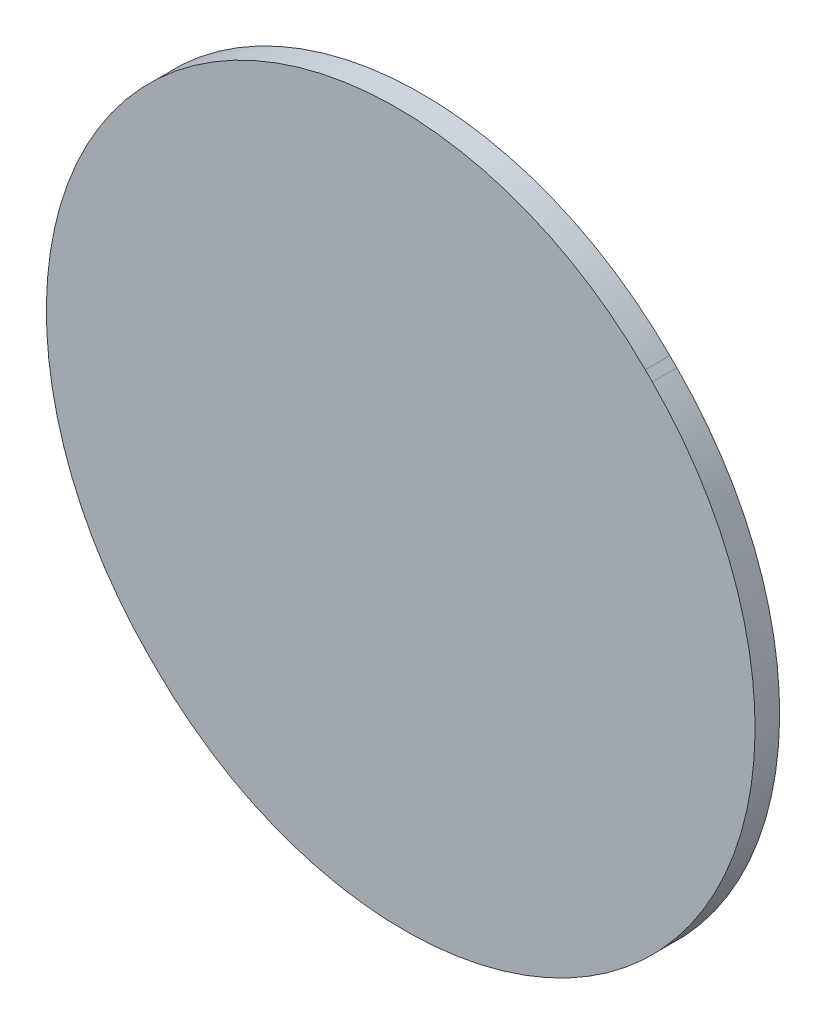
ISO-10303-21;
HEADER;
FILE_DESCRIPTION(('STEP AP214'),'2;1');
FILE_NAME('part.step','',(''),(''),'','','');
FILE_SCHEMA(('AUTOMOTIVE_DESIGN { 1 0 10303 214 1 1 1 1 }'));
ENDSEC;
DATA;
#1=APPLICATION_CONTEXT('core data for automotive mechanical design processes');
#2=APPLICATION_PROTOCOL_DEFINITION('international standard','automotive_design',2000,#1);
#3=PRODUCT_CONTEXT('',#1,'mechanical');
#4=PRODUCT('Part','Part','',(#3));
#5=PRODUCT_RELATED_PRODUCT_CATEGORY('part','',(#4));
#6=PRODUCT_DEFINITION_FORMATION('','',#4);
#7=PRODUCT_DEFINITION_CONTEXT('part definition',#1,'design');
#8=PRODUCT_DEFINITION('design','',#6,#7);
#9=PRODUCT_DEFINITION_SHAPE('','',#8);
#10=(LENGTH_UNIT() NAMED_UNIT(*) SI_UNIT(.MILLI.,.METRE.));
#11=(NAMED_UNIT(*) PLANE_ANGLE_UNIT() SI_UNIT($,.RADIAN.));
#12=(NAMED_UNIT(*) SI_UNIT($,.STERADIAN.) SOLID_ANGLE_UNIT());
#13=UNCERTAINTY_MEASURE_WITH_UNIT(LENGTH_MEASURE(1.E-05),#10,'distance_accuracy_value','');
#14=(GEOMETRIC_REPRESENTATION_CONTEXT(3) GLOBAL_UNCERTAINTY_ASSIGNED_CONTEXT((#13)) GLOBAL_UNIT_ASSIGNED_CONTEXT((#10,
#11,#12)) REPRESENTATION_CONTEXT('',''));
#15=CARTESIAN_POINT('',(0.,0.,0.));
#16=DIRECTION('',(0.,0.,1.));
#17=DIRECTION('',(1.,0.,0.));
#18=AXIS2_PLACEMENT_3D('',#15,#16,#17);
#19=CARTESIAN_POINT('',(123.696446,-93.823553,1.635));
#20=DIRECTION('',(0.,0.,1.));
#21=DIRECTION('',(1.,0.,0.));
#22=AXIS2_PLACEMENT_3D('',#19,#20,#21);
#23=PLANE('',#22);
#24=DIRECTION('',(0.707106781187048,-0.707106781186048,0.));
#25=VECTOR('',#24,1.);
#26=CARTESIAN_POINT('',(123.696446,-93.823553,1.635));
#27=LINE('',#26,#25);
#28=CARTESIAN_POINT('',(123.696446,-93.823553,1.635));
#29=VERTEX_POINT('',#28);
#30=CARTESIAN_POINT('',(123.706446,-93.833553,1.635));
#31=VERTEX_POINT('',#30);
#32=EDGE_CURVE('E84',#29,#31,#27,.T.);
#33=ORIENTED_EDGE('',*,*,#32,.T.);
#34=CARTESIAN_POINT('',(124.0599995,-93.4799995,1.635));
#35=DIRECTION('',(0.,0.,1.));
#36=DIRECTION('',(-0.707106781186548,-0.707106781186548,0.));
#37=AXIS2_PLACEMENT_3D('',#34,#35,#36);
#38=CIRCLE('',#37,0.500000154724);
#39=CARTESIAN_POINT('',(124.413553,-93.126446,1.635));
#40=VERTEX_POINT('',#39);
#41=EDGE_CURVE('E99',#31,#40,#38,.T.);
#42=ORIENTED_EDGE('',*,*,#41,.T.);
#43=DIRECTION('',(-0.707106781186048,0.707106781187048,0.));
#44=VECTOR('',#43,1.);
#45=CARTESIAN_POINT('',(124.413553,-93.126446,1.635));
#46=LINE('',#45,#44);
#47=CARTESIAN_POINT('',(124.403553,-93.116446,1.635));
#48=VERTEX_POINT('',#47);
#49=EDGE_CURVE('E76',#40,#48,#46,.T.);
#50=ORIENTED_EDGE('',*,*,#49,.T.);
#51=CARTESIAN_POINT('',(124.0499995,-93.4699995,1.635));
#52=DIRECTION('',(0.,0.,1.));
#53=DIRECTION('',(0.707106781186548,0.707106781186548,0.));
#54=AXIS2_PLACEMENT_3D('',#51,#52,#53);
#55=CIRCLE('',#54,0.500000154724);
#56=EDGE_CURVE('E11',#48,#29,#55,.T.);
#57=ORIENTED_EDGE('',*,*,#56,.T.);
#58=EDGE_LOOP('',(#33,#42,#50,#57));
#59=FACE_BOUND('',#58,.T.);
#60=ADVANCED_FACE('F17',(#59),#23,.T.);
#61=CARTESIAN_POINT('',(123.696446,-93.823553,1.6));
#62=DIRECTION('',(0.,0.,1.));
#63=DIRECTION('',(1.,0.,0.));
#64=AXIS2_PLACEMENT_3D('',#61,#62,#63);
#65=PLANE('',#64);
#66=CARTESIAN_POINT('',(124.0499995,-93.4699995,1.6));
#67=DIRECTION('',(0.,0.,1.));
#68=DIRECTION('',(0.707106781186548,0.707106781186548,0.));
#69=AXIS2_PLACEMENT_3D('',#66,#67,#68);
#70=CIRCLE('',#69,0.500000154724);
#71=CARTESIAN_POINT('',(124.403553,-93.116446,1.6));
#72=VERTEX_POINT('',#71);
#73=CARTESIAN_POINT('',(123.696446,-93.823553,1.6));
#74=VERTEX_POINT('',#73);
#75=EDGE_CURVE('E27',#72,#74,#70,.T.);
#76=ORIENTED_EDGE('',*,*,#75,.F.);
#77=DIRECTION('',(-0.707106781186048,0.707106781187048,0.));
#78=VECTOR('',#77,1.);
#79=CARTESIAN_POINT('',(124.413553,-93.126446,1.6));
#80=LINE('',#79,#78);
#81=CARTESIAN_POINT('',(124.413553,-93.126446,1.6));
#82=VERTEX_POINT('',#81);
#83=EDGE_CURVE('E110',#82,#72,#80,.T.);
#84=ORIENTED_EDGE('',*,*,#83,.F.);
#85=CARTESIAN_POINT('',(124.0599995,-93.4799995,1.6));
#86=DIRECTION('',(0.,0.,1.));
#87=DIRECTION('',(-0.707106781186548,-0.707106781186548,0.));
#88=AXIS2_PLACEMENT_3D('',#85,#86,#87);
#89=CIRCLE('',#88,0.500000154724);
#90=CARTESIAN_POINT('',(123.706446,-93.833553,1.6));
#91=VERTEX_POINT('',#90);
#92=EDGE_CURVE('E86',#91,#82,#89,.T.);
#93=ORIENTED_EDGE('',*,*,#92,.F.);
#94=DIRECTION('',(0.707106781187048,-0.707106781186048,0.));
#95=VECTOR('',#94,1.);
#96=CARTESIAN_POINT('',(123.696446,-93.823553,1.6));
#97=LINE('',#96,#95);
#98=EDGE_CURVE('E82',#74,#91,#97,.T.);
#99=ORIENTED_EDGE('',*,*,#98,.F.);
#100=EDGE_LOOP('',(#76,#84,#93,#99));
#101=FACE_BOUND('',#100,.T.);
#102=ADVANCED_FACE('F19',(#101),#65,.F.);
#103=CARTESIAN_POINT('',(124.0499995,-93.4699995,1.6));
#104=DIRECTION('',(0.,0.,-1.));
#105=DIRECTION('',(0.707106781186548,0.707106781186548,0.));
#106=AXIS2_PLACEMENT_3D('',#103,#104,#105);
#107=CYLINDRICAL_SURFACE('',#106,0.500000154724);
#108=ORIENTED_EDGE('',*,*,#75,.T.);
#109=DIRECTION('',(0.,0.,1.));
#110=VECTOR('',#109,1.);
#111=CARTESIAN_POINT('',(123.696446,-93.823553,1.6));
#112=LINE('',#111,#110);
#113=EDGE_CURVE('E71',#74,#29,#112,.T.);
#114=ORIENTED_EDGE('',*,*,#113,.T.);
#115=ORIENTED_EDGE('',*,*,#56,.F.);
#116=DIRECTION('',(0.,0.,1.));
#117=VECTOR('',#116,1.);
#118=CARTESIAN_POINT('',(124.403553,-93.116446,1.6));
#119=LINE('',#118,#117);
#120=EDGE_CURVE('E21',#72,#48,#119,.T.);
#121=ORIENTED_EDGE('',*,*,#120,.F.);
#122=EDGE_LOOP('',(#108,#114,#115,#121));
#123=FACE_BOUND('',#122,.T.);
#124=ADVANCED_FACE('F70',(#123),#107,.T.);
#125=CARTESIAN_POINT('',(124.413553,-93.126446,1.6));
#126=DIRECTION('',(-0.707106781187048,-0.707106781186048,0.));
#127=DIRECTION('',(-0.707106781186048,0.707106781187048,0.));
#128=AXIS2_PLACEMENT_3D('',#125,#126,#127);
#129=PLANE('',#128);
#130=ORIENTED_EDGE('',*,*,#83,.T.);
#131=ORIENTED_EDGE('',*,*,#120,.T.);
#132=ORIENTED_EDGE('',*,*,#49,.F.);
#133=DIRECTION('',(0.,0.,1.));
#134=VECTOR('',#133,1.);
#135=CARTESIAN_POINT('',(124.413553,-93.126446,1.6));
#136=LINE('',#135,#134);
#137=EDGE_CURVE('E106',#82,#40,#136,.T.);
#138=ORIENTED_EDGE('',*,*,#137,.F.);
#139=EDGE_LOOP('',(#130,#131,#132,#138));
#140=FACE_BOUND('',#139,.T.);
#141=ADVANCED_FACE('F124',(#140),#129,.F.);
#142=CARTESIAN_POINT('',(124.0599995,-93.4799995,1.6));
#143=DIRECTION('',(0.,0.,-1.));
#144=DIRECTION('',(-0.707106781186548,-0.707106781186548,0.));
#145=AXIS2_PLACEMENT_3D('',#142,#143,#144);
#146=CYLINDRICAL_SURFACE('',#145,0.500000154724);
#147=ORIENTED_EDGE('',*,*,#92,.T.);
#148=ORIENTED_EDGE('',*,*,#137,.T.);
#149=ORIENTED_EDGE('',*,*,#41,.F.);
#150=DIRECTION('',(0.,0.,1.));
#151=VECTOR('',#150,1.);
#152=CARTESIAN_POINT('',(123.706446,-93.833553,1.6));
#153=LINE('',#152,#151);
#154=EDGE_CURVE('E91',#91,#31,#153,.T.);
#155=ORIENTED_EDGE('',*,*,#154,.F.);
#156=EDGE_LOOP('',(#147,#148,#149,#155));
#157=FACE_BOUND('',#156,.T.);
#158=ADVANCED_FACE('F123',(#157),#146,.T.);
#159=CARTESIAN_POINT('',(123.696446,-93.823553,1.6));
#160=DIRECTION('',(0.707106781186048,0.707106781187048,0.));
#161=DIRECTION('',(0.,0.,-1.));
#162=AXIS2_PLACEMENT_3D('',#159,#160,#161);
#163=PLANE('',#162);
#164=ORIENTED_EDGE('',*,*,#98,.T.);
#165=ORIENTED_EDGE('',*,*,#154,.T.);
#166=ORIENTED_EDGE('',*,*,#32,.F.);
#167=ORIENTED_EDGE('',*,*,#113,.F.);
#168=EDGE_LOOP('',(#164,#165,#166,#167));
#169=FACE_BOUND('',#168,.T.);
#170=ADVANCED_FACE('F80',(#169),#163,.F.);
#171=CLOSED_SHELL('',(#60,#102,#124,#141,#158,#170));
#172=MANIFOLD_SOLID_BREP('B1',#171);
#173=ADVANCED_BREP_SHAPE_REPRESENTATION('',(#18,#172),#14);
#174=SHAPE_DEFINITION_REPRESENTATION(#9,#173);
ENDSEC;
END-ISO-10303-21;
